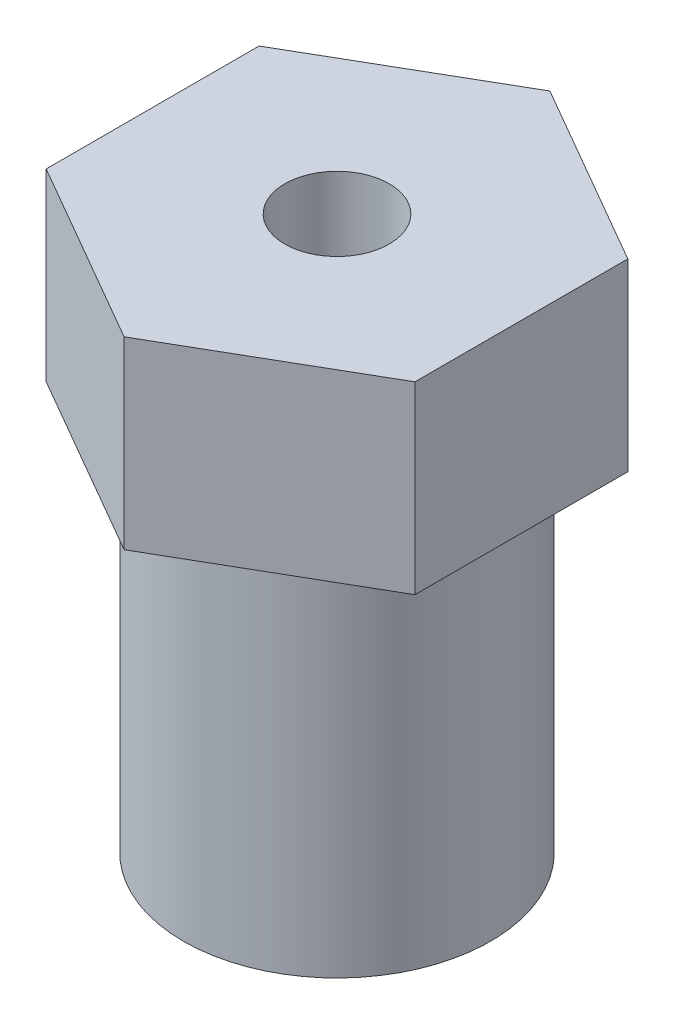
ISO-10303-21;
HEADER;
FILE_DESCRIPTION(('STEP AP214'),'2;1');
FILE_NAME('part.step','',(''),(''),'','','');
FILE_SCHEMA(('AUTOMOTIVE_DESIGN { 1 0 10303 214 1 1 1 1 }'));
ENDSEC;
DATA;
#1=APPLICATION_CONTEXT('core data for automotive mechanical design processes');
#2=APPLICATION_PROTOCOL_DEFINITION('international standard','automotive_design',2000,#1);
#3=PRODUCT_CONTEXT('',#1,'mechanical');
#4=PRODUCT('Part','Part','',(#3));
#5=PRODUCT_RELATED_PRODUCT_CATEGORY('part','',(#4));
#6=PRODUCT_DEFINITION_FORMATION('','',#4);
#7=PRODUCT_DEFINITION_CONTEXT('part definition',#1,'design');
#8=PRODUCT_DEFINITION('design','',#6,#7);
#9=PRODUCT_DEFINITION_SHAPE('','',#8);
#10=(LENGTH_UNIT() NAMED_UNIT(*) SI_UNIT(.MILLI.,.METRE.));
#11=(NAMED_UNIT(*) PLANE_ANGLE_UNIT() SI_UNIT($,.RADIAN.));
#12=(NAMED_UNIT(*) SI_UNIT($,.STERADIAN.) SOLID_ANGLE_UNIT());
#13=UNCERTAINTY_MEASURE_WITH_UNIT(LENGTH_MEASURE(1.E-05),#10,'distance_accuracy_value','');
#14=(GEOMETRIC_REPRESENTATION_CONTEXT(3) GLOBAL_UNCERTAINTY_ASSIGNED_CONTEXT((#13)) GLOBAL_UNIT_ASSIGNED_CONTEXT((#10,
#11,#12)) REPRESENTATION_CONTEXT('',''));
#15=CARTESIAN_POINT('',(0.,0.,0.));
#16=DIRECTION('',(0.,0.,1.));
#17=DIRECTION('',(1.,0.,0.));
#18=AXIS2_PLACEMENT_3D('',#15,#16,#17);
#19=CARTESIAN_POINT('',(-3.,6.,-5.19615242270664));
#20=DIRECTION('',(-0.5,0.,-0.866025403784438));
#21=DIRECTION('',(-0.866025403784439,0.,0.5));
#22=AXIS2_PLACEMENT_3D('',#19,#20,#21);
#23=CYLINDRICAL_SURFACE('',#22,1.69999999999999);
#24=CARTESIAN_POINT('',(0.,6.79999999999998,-3.));
#25=CARTESIAN_POINT('',(-0.05408169265973,6.88781961083474,-2.99999842011512));
#26=CARTESIAN_POINT('',(-0.11584986274738,6.97092265030721,-2.99853255813965));
#27=CARTESIAN_POINT('',(-0.251580183169669,7.12625088742073,-2.99020647210895));
#28=CARTESIAN_POINT('',(-0.325555140778262,7.19846450602118,-2.98334055355004));
#29=CARTESIAN_POINT('',(-0.482982376331943,7.33058608028531,-2.96193211334839));
#30=CARTESIAN_POINT('',(-0.56644430771567,7.39048132419887,-2.94738171651048));
#31=CARTESIAN_POINT('',(-0.739897877773428,7.49601278090847,-2.90868096501998));
#32=CARTESIAN_POINT('',(-0.829883890136409,7.5416611040453,-2.88453880357756));
#33=CARTESIAN_POINT('',(-1.00887962701823,7.6149604397967,-2.82676304946186));
#34=CARTESIAN_POINT('',(-1.09774410608916,7.64334225341772,-2.79361673714729));
#35=CARTESIAN_POINT('',(-1.27489957816332,7.68367031629994,-2.71733254736103));
#36=CARTESIAN_POINT('',(-1.36319104222212,7.6956324155236,-2.67420435248285));
#37=CARTESIAN_POINT('',(-1.5248859990315,7.7019614399458,-2.58499256321337));
#38=CARTESIAN_POINT('',(-1.59878255194164,7.69831671712663,-2.53992971618292));
#39=CARTESIAN_POINT('',(-1.74116848270436,7.67804128946428,-2.44451880767874));
#40=CARTESIAN_POINT('',(-1.80965816352961,7.66141131281595,-2.39417104271284));
#41=CARTESIAN_POINT('',(-1.93804307206996,7.61653585479174,-2.29141739960441));
#42=CARTESIAN_POINT('',(-1.99810829551771,7.58858622480206,-2.23909263634188));
#43=CARTESIAN_POINT('',(-2.11081351753923,7.52217046659896,-2.13317926024697));
#44=CARTESIAN_POINT('',(-2.16345193033774,7.48370209755677,-2.0795903803424));
#45=CARTESIAN_POINT('',(-2.26567953207534,7.39325492628011,-1.9679818983662));
#46=CARTESIAN_POINT('',(-2.31450655739578,7.340341035683,-1.91002388404943));
#47=CARTESIAN_POINT('',(-2.40314245716176,7.22447784736072,-1.79723761210463));
#48=CARTESIAN_POINT('',(-2.44294174111377,7.16151799724178,-1.74241272872222));
#49=CARTESIAN_POINT('',(-2.51798674739819,7.01879947622295,-1.63238218969293));
#50=CARTESIAN_POINT('',(-2.55216808185899,6.93793922894885,-1.57787065692512));
#51=CARTESIAN_POINT('',(-2.61024937587533,6.76646107669214,-1.47981572008613));
#52=CARTESIAN_POINT('',(-2.63415947316876,6.67585290393186,-1.43626151877994));
#53=CARTESIAN_POINT('',(-2.6684041815498,6.50521626410009,-1.37138485768083));
#54=CARTESIAN_POINT('',(-2.68047452737696,6.42655677976909,-1.34738620379777));
#55=CARTESIAN_POINT('',(-2.6982723487657,6.26587538127644,-1.31138832935055));
#56=CARTESIAN_POINT('',(-2.70400741191225,6.1838576116568,-1.29937475627676));
#57=CARTESIAN_POINT('',(-2.7091706920176,6.0184960092893,-1.28857865215158));
#58=CARTESIAN_POINT('',(-2.70858019415916,5.93514897049141,-1.28983538248938));
#59=CARTESIAN_POINT('',(-2.70104647521384,5.76998520070034,-1.30553343364534));
#60=CARTESIAN_POINT('',(-2.69410005791733,5.68816926077823,-1.31998138794386));
#61=CARTESIAN_POINT('',(-2.67421401115099,5.53134855143156,-1.35979577621028));
#62=CARTESIAN_POINT('',(-2.66150650325925,5.45620367579721,-1.3847368571845));
#63=CARTESIAN_POINT('',(-2.63010523926771,5.31081793839377,-1.44348611278553));
#64=CARTESIAN_POINT('',(-2.61140932149964,5.24057885866526,-1.47729748857125));
#65=CARTESIAN_POINT('',(-2.56480646862616,5.09648655712385,-1.55697753274693));
#66=CARTESIAN_POINT('',(-2.53597770764162,5.0234989025504,-1.60387068535018));
#67=CARTESIAN_POINT('',(-2.46992452567164,4.88600319753576,-1.70383892133012));
#68=CARTESIAN_POINT('',(-2.43269314476303,4.8215022471779,-1.75691911172994));
#69=CARTESIAN_POINT('',(-2.34377377735252,4.69388203930191,-1.87425823230111));
#70=CARTESIAN_POINT('',(-2.29081045598446,4.63213443732866,-1.93905728510565));
#71=CARTESIAN_POINT('',(-2.17321979261564,4.5226880254782,-2.069986734252));
#72=CARTESIAN_POINT('',(-2.10859568958922,4.4749853240572,-2.1361167563747));
#73=CARTESIAN_POINT('',(-1.97098953851385,4.39729840260364,-2.26354234621131));
#74=CARTESIAN_POINT('',(-1.8984553124316,4.36667144558871,-2.32492510802883));
#75=CARTESIAN_POINT('',(-1.74461579704232,4.32196888379412,-2.44246757305399));
#76=CARTESIAN_POINT('',(-1.66332054009747,4.30787456262987,-2.49863311612159));
#77=CARTESIAN_POINT('',(-1.50529060531348,4.29778908231391,-2.59646757662748));
#78=CARTESIAN_POINT('',(-1.42925746120449,4.29975398732385,-2.63907102471868));
#79=CARTESIAN_POINT('',(-1.27497936146063,4.31689698120534,-2.71696325524233));
#80=CARTESIAN_POINT('',(-1.1967345756648,4.33207405812473,-2.75225259762353));
#81=CARTESIAN_POINT('',(-1.04315970159673,4.37416835500948,-2.81397417775792));
#82=CARTESIAN_POINT('',(-0.967818867473064,4.40068032070097,-2.84066093632769));
#83=CARTESIAN_POINT('',(-0.819503870906033,4.46430590331753,-2.88694566956916));
#84=CARTESIAN_POINT('',(-0.746530173326471,4.5014215887577,-2.90654225943778));
#85=CARTESIAN_POINT('',(-0.598380708122485,4.58890626107131,-2.94078680808685));
#86=CARTESIAN_POINT('',(-0.523592864252902,4.64016439928516,-2.95483452376178));
#87=CARTESIAN_POINT('',(-0.380897858422043,4.75270872757631,-2.97659840220921));
#88=CARTESIAN_POINT('',(-0.31299769745678,4.81400495871614,-2.98430817819977));
#89=CARTESIAN_POINT('',(-0.178475553782575,4.95339298110832,-2.99553382772199));
#90=CARTESIAN_POINT('',(-0.11296805612401,5.03261553520194,-2.99844115570703));
#91=CARTESIAN_POINT('',(0.00395170643339162,5.2009106307356,-3.00056838201603));
#92=CARTESIAN_POINT('',(0.0553752348809439,5.28997522059763,-2.99979123613255));
#93=CARTESIAN_POINT('',(0.132870092929511,5.45905164296436,-2.99725987916219));
#94=CARTESIAN_POINT('',(0.161862463285092,5.53772397881135,-2.99571121709793));
#95=CARTESIAN_POINT('',(0.206280719317359,5.69878963935455,-2.99298401410815));
#96=CARTESIAN_POINT('',(0.221722993947297,5.78117834184618,-2.99180502717033));
#97=CARTESIAN_POINT('',(0.237833260595179,5.94772326187039,-2.99056976027155));
#98=CARTESIAN_POINT('',(0.238447907908849,6.03188477131879,-2.99051753407944));
#99=CARTESIAN_POINT('',(0.224707994913821,6.19897352067671,-2.99157964052133));
#100=CARTESIAN_POINT('',(0.210348528585427,6.28190034703134,-2.99269435548469));
#101=CARTESIAN_POINT('',(0.168941074284039,6.4400278492101,-2.99530546548334));
#102=CARTESIAN_POINT('',(0.142561406538309,6.51540759423706,-2.9967800597025));
#103=CARTESIAN_POINT('',(0.0789893740049566,6.66146584789714,-2.99912814947559));
#104=CARTESIAN_POINT('',(0.0417894041836181,6.73214100683732,-3.00000122079108));
#105=CARTESIAN_POINT('',(0.,6.79999999999998,-3.));
#106=B_SPLINE_CURVE_WITH_KNOTS('',3,(#24,#25,#26,#27,#28,#29,#30,#31,#32,#33,#34,#35,#36,#37,
#38,#39,#40,#41,#42,#43,#44,#45,#46,#47,#48,#49,#50,#51,#52,#53,#54,#55,#56,#57,#58,#59,#60,#61,
#62,#63,#64,#65,#66,#67,#68,#69,#70,#71,#72,#73,#74,#75,#76,#77,#78,#79,#80,#81,#82,#83,#84,#85,
#86,#87,#88,#89,#90,#91,#92,#93,#94,#95,#96,#97,#98,#99,#100,#101,#102,#103,#104,#105),
.UNSPECIFIED.,.T.,.F.,(4,2,2,2,2,2,2,2,2,2,2,2,2,2,2,2,2,2,2,2,2,2,2,2,2,2,2,2,2,2,2,2,2,2,2,2,
2,2,2,2,4),(0.,0.309103118637499,0.618532632506998,0.928279872558717,1.23776309584082,
1.53302093289259,1.82799355642621,2.08658144245674,2.3451548282823,2.59736634859509,
2.84963163996676,3.12581233294823,3.40228506265132,3.71084137226387,4.01909243233194,
4.26740108876914,4.51541202958213,4.76415693822371,5.01302700233424,5.25265587010564,
5.49237133565607,5.76557012074642,6.03899603344368,6.34947380416687,6.65986546695699,
6.9576104158414,7.25501796517906,7.51522377722609,7.77540966123482,8.02698283348582,
8.27860511479093,8.55275851048861,8.82718783481127,9.13428758585227,9.44114101420879,
9.69166512924072,9.94188581393857,10.1930065728861,10.4442096332381,10.6828881960336,
10.9217349207548),.UNSPECIFIED.);
#107=CARTESIAN_POINT('',(0.,6.79999999999998,-3.));
#108=VERTEX_POINT('',#107);
#109=EDGE_CURVE('E147',#108,#108,#106,.T.);
#110=ORIENTED_EDGE('',*,*,#109,.T.);
#111=EDGE_LOOP('',(#110));
#112=FACE_BOUND('',#111,.T.);
#113=CARTESIAN_POINT('',(-2.5,6.,-4.3301270189222));
#114=DIRECTION('',(-0.5,0.,-0.866025403784438));
#115=DIRECTION('',(-0.866025403784438,0.,0.5));
#116=AXIS2_PLACEMENT_3D('',#113,#114,#115);
#117=CIRCLE('',#116,1.69999999999999);
#118=CARTESIAN_POINT('',(-3.97224318643354,6.,-3.4801270189222));
#119=VERTEX_POINT('',#118);
#120=EDGE_CURVE('E135',#119,#119,#117,.F.);
#121=ORIENTED_EDGE('',*,*,#120,.F.);
#122=EDGE_LOOP('',(#121));
#123=FACE_BOUND('',#122,.T.);
#124=ADVANCED_FACE('F35',(#112,#123),#23,.F.);
#125=CARTESIAN_POINT('',(4.5006830127019,6.,7.79541164676185));
#126=DIRECTION('',(-0.5,0.,-0.866025403784438));
#127=DIRECTION('',(-0.866025403784439,0.,0.5));
#128=AXIS2_PLACEMENT_3D('',#125,#126,#127);
#129=CYLINDRICAL_SURFACE('',#128,2.5493621783471);
#130=CARTESIAN_POINT('',(-4.35843746343336,6.,-2.45031077158401));
#131=CARTESIAN_POINT('',(-4.35843474018136,6.13242592835763,-2.45032826808866));
#132=CARTESIAN_POINT('',(-4.35254571689391,6.26501521387592,-2.46088318635183));
#133=CARTESIAN_POINT('',(-4.3290047454725,6.5260879254046,-2.50204754187415));
#134=CARTESIAN_POINT('',(-4.31132906271113,6.65456251753066,-2.53269744201476));
#135=CARTESIAN_POINT('',(-4.26437981041503,6.90313592021332,-2.61096055717455));
#136=CARTESIAN_POINT('',(-4.23516979816396,7.02327645848354,-2.65848067025964));
#137=CARTESIAN_POINT('',(-4.1650929988781,7.25358987936444,-2.76697644766752));
#138=CARTESIAN_POINT('',(-4.12422519082727,7.36376188779507,-2.8279532904551));
#139=CARTESIAN_POINT('',(-4.02657949662629,7.58146147598714,-2.96552832104463));
#140=CARTESIAN_POINT('',(-3.96873595591368,7.68794766276453,-3.04301875519778));
#141=CARTESIAN_POINT('',(-3.83866690142188,7.8853238227186,-3.20553792859178));
#142=CARTESIAN_POINT('',(-3.76643400570172,7.97620574594729,-3.29057052459471));
#143=CARTESIAN_POINT('',(-3.60177665440593,8.14609788539377,-3.47031239521371));
#144=CARTESIAN_POINT('',(-3.508284851063,8.22381236694947,-3.56528057340904));
#145=CARTESIAN_POINT('',(-3.30526791451359,8.35605154263622,-3.75424801663677));
#146=CARTESIAN_POINT('',(-3.19575335964838,8.41059144475398,-3.84824787746577));
#147=CARTESIAN_POINT('',(-2.97137567063272,8.49075963192941,-4.02364117242568));
#148=CARTESIAN_POINT('',(-2.85749734597724,8.51821834491896,-4.10545336455949));
#149=CARTESIAN_POINT('',(-2.62093520639103,8.54948765515492,-4.26035662772273));
#150=CARTESIAN_POINT('',(-2.498257015185,8.55331322178932,-4.33345319050352));
#151=CARTESIAN_POINT('',(-2.25966278054755,8.53787982490927,-4.46213407461893));
#152=CARTESIAN_POINT('',(-2.14413709987689,8.52067515398633,-4.51870389883828));
#153=CARTESIAN_POINT('',(-1.91282113769791,8.46736669165771,-4.62137760300195));
#154=CARTESIAN_POINT('',(-1.79703083696716,8.43126148083563,-4.66748069652977));
#155=CARTESIAN_POINT('',(-1.56706760050104,8.34098207385927,-4.74967624045102));
#156=CARTESIAN_POINT('',(-1.45293699688411,8.28657271447384,-4.78562658432226));
#157=CARTESIAN_POINT('',(-1.23100702865721,8.1615751811913,-4.84746453339607));
#158=CARTESIAN_POINT('',(-1.12320991413972,8.09098130057776,-4.87334858048785));
#159=CARTESIAN_POINT('',(-0.906659690568706,7.92774404988494,-4.91847117400741));
#160=CARTESIAN_POINT('',(-0.798833314420978,7.83362392760335,-4.93681852560103));
#161=CARTESIAN_POINT('',(-0.597501973262954,7.62993839045092,-4.96521398389935));
#162=CARTESIAN_POINT('',(-0.50400880089441,7.52036039842528,-4.9752552863403));
#163=CARTESIAN_POINT('',(-0.329217340193053,7.27978167968964,-4.98997266328497));
#164=CARTESIAN_POINT('',(-0.249179896839478,7.14783108411252,-4.99423766575049));
#165=CARTESIAN_POINT('',(-0.114433323471274,6.87152113433902,-4.99914941394098));
#166=CARTESIAN_POINT('',(-0.0596969641099141,6.72717531942434,-4.9998000578353));
#167=CARTESIAN_POINT('',(0.0168055637891447,6.44229734119767,-5.00010827943268));
#168=CARTESIAN_POINT('',(0.0408618940561221,6.30238617850803,-4.99984124330395));
#169=CARTESIAN_POINT('',(0.061614730456127,6.02058812721735,-4.99963366800008));
#170=CARTESIAN_POINT('',(0.0583324240379804,5.87870285368028,-4.99969287597365));
#171=CARTESIAN_POINT('',(0.0267530582802505,5.61455469511559,-4.99994591571752));
#172=CARTESIAN_POINT('',(0.00140079561449291,5.49192426374894,-5.00012334064891));
#173=CARTESIAN_POINT('',(-0.068626119677459,5.25232668651963,-4.99965069481582));
#174=CARTESIAN_POINT('',(-0.113307363467762,5.13536148763809,-4.99900034163272));
#175=CARTESIAN_POINT('',(-0.222002207433863,4.90427155618175,-4.99537667042951));
#176=CARTESIAN_POINT('',(-0.286810425681824,4.7905248719053,-4.99229789073031));
#177=CARTESIAN_POINT('',(-0.431988936743663,4.57365709897623,-4.9818350277141));
#178=CARTESIAN_POINT('',(-0.51236724412999,4.47054152466295,-4.97444872318109));
#179=CARTESIAN_POINT('',(-0.69745418830475,4.26360365632202,-4.95210464042128));
#180=CARTESIAN_POINT('',(-0.803974279151221,4.16148785951105,-4.9362754701477));
#181=CARTESIAN_POINT('',(-1.02977465854472,3.97494960903647,-4.89415508221757));
#182=CARTESIAN_POINT('',(-1.14905979000597,3.89053390679263,-4.86785988350439));
#183=CARTESIAN_POINT('',(-1.40031760692858,3.73956011764782,-4.80171552553947));
#184=CARTESIAN_POINT('',(-1.53256632220991,3.67362531954706,-4.7614773776739));
#185=CARTESIAN_POINT('',(-1.80156631559727,3.56601410379657,-4.66633041008536));
#186=CARTESIAN_POINT('',(-1.93831336708179,3.52431556500349,-4.61143503545447));
#187=CARTESIAN_POINT('',(-2.19794552418598,3.47008458744953,-4.49304497853895));
#188=CARTESIAN_POINT('',(-2.32092533345073,3.45517894339486,-4.43084372234883));
#189=CARTESIAN_POINT('',(-2.56175475106549,3.44788273191579,-4.29609361061714));
#190=CARTESIAN_POINT('',(-2.6796062895383,3.45548361804209,-4.2235486928529));
#191=CARTESIAN_POINT('',(-2.89845805694549,3.49145075216617,-4.07616724358668));
#192=CARTESIAN_POINT('',(-3.00006048010486,3.51832113375102,-4.00184947660826));
#193=CARTESIAN_POINT('',(-3.19347436338754,3.58999420262173,-3.84927312756091));
#194=CARTESIAN_POINT('',(-3.28528446897587,3.63479936669591,-3.77101400249702));
#195=CARTESIAN_POINT('',(-3.46142306098998,3.74297774102967,-3.61017573080965));
#196=CARTESIAN_POINT('',(-3.54528232980237,3.80704495954281,-3.52755217311567));
#197=CARTESIAN_POINT('',(-3.70046397569924,3.95106352218964,-3.36441129880491));
#198=CARTESIAN_POINT('',(-3.77178062380621,4.03102208953492,-3.28389495890085));
#199=CARTESIAN_POINT('',(-3.90857223852594,4.2140842630159,-3.1201887506843));
#200=CARTESIAN_POINT('',(-3.97269093029188,4.31872287125662,-3.03757634063891));
#201=CARTESIAN_POINT('',(-4.08604752618703,4.54319552239309,-2.88329644292488));
#202=CARTESIAN_POINT('',(-4.13527135592535,4.66304378632809,-2.81163933852671));
#203=CARTESIAN_POINT('',(-4.22072311908496,4.92062689847625,-2.68175372708998));
#204=CARTESIAN_POINT('',(-4.25638926030063,5.05886672872528,-2.6241354492129));
#205=CARTESIAN_POINT('',(-4.29810199527818,5.27364798589101,-2.55480591124155));
#206=CARTESIAN_POINT('',(-4.31003639808117,5.34641017844248,-2.5345562184029));
#207=CARTESIAN_POINT('',(-4.33001368128678,5.49389018875048,-2.50027591637198));
#208=CARTESIAN_POINT('',(-4.33805924318102,5.5686066214101,-2.48624102242057));
#209=CARTESIAN_POINT('',(-4.3489138405607,5.70277321144238,-2.46719276618697));
#210=CARTESIAN_POINT('',(-4.35248405865753,5.76198058953385,-2.46087638550313));
#211=CARTESIAN_POINT('',(-4.35724656224872,5.88078092214493,-2.4524313099679));
#212=CARTESIAN_POINT('',(-4.35843868960479,5.94037390204194,-2.4503028936079));
#213=CARTESIAN_POINT('',(-4.35843746343336,6.,-2.45031077158401));
#214=B_SPLINE_CURVE_WITH_KNOTS('',3,(#130,#131,#132,#133,#134,#135,#136,#137,#138,#139,#140,
#141,#142,#143,#144,#145,#146,#147,#148,#149,#150,#151,#152,#153,#154,#155,#156,#157,#158,#159,
#160,#161,#162,#163,#164,#165,#166,#167,#168,#169,#170,#171,#172,#173,#174,#175,#176,#177,#178,
#179,#180,#181,#182,#183,#184,#185,#186,#187,#188,#189,#190,#191,#192,#193,#194,#195,#196,#197,
#198,#199,#200,#201,#202,#203,#204,#205,#206,#207,#208,#209,#210,#211,#212,#213),.UNSPECIFIED.,
.T.,.F.,(4,2,2,2,2,2,2,2,2,2,2,2,2,2,2,2,2,2,2,2,2,2,2,2,2,2,2,2,2,2,2,2,2,2,2,2,2,2,2,2,2,4),
(0.,0.397036179111605,0.794874288400811,1.19055012586621,1.58626062815893,2.01598646991388,
2.44593333743397,2.90631452459125,3.36639312482059,3.79265457690301,4.21864600451408,
4.60615226712096,4.99368763533404,5.38640514339148,5.77926133851125,6.21032683141178,
6.64174510174315,7.10248735089337,7.56273258224711,7.9861038316588,8.40914699881666,
8.78313490643325,9.15725044422007,9.54857222927018,9.94009598175743,10.3833465995609,
10.8267659819339,11.2837116564872,11.7402396057355,12.1538530676552,12.5673094874606,
12.9517283789422,13.3362003768881,13.7366435004784,14.1372690584275,14.5791196874475,
15.0213865336425,15.4803767371496,15.7094618606165,15.9383887957455,16.117146417492,
16.2959159258671),.UNSPECIFIED.);
#215=CARTESIAN_POINT('',(-2.50000000000001,8.5493621783471,-4.3301270189222));
#216=VERTEX_POINT('',#215);
#217=CARTESIAN_POINT('',(-2.5,3.4506378216529,-4.33012701892219));
#218=VERTEX_POINT('',#217);
#219=EDGE_CURVE('E139',#216,#218,#214,.T.);
#220=ORIENTED_EDGE('',*,*,#219,.T.);
#221=CARTESIAN_POINT('',(-2.5,6.,-4.3301270189222));
#222=DIRECTION('',(-0.5,0.,-0.866025403784438));
#223=DIRECTION('',(-0.866025403784438,0.,0.5));
#224=AXIS2_PLACEMENT_3D('',#221,#222,#223);
#225=CIRCLE('',#224,2.5493621783471);
#226=EDGE_CURVE('E49',#216,#218,#225,.T.);
#227=ORIENTED_EDGE('',*,*,#226,.F.);
#228=EDGE_LOOP('',(#220,#227));
#229=FACE_BOUND('',#228,.T.);
#230=ADVANCED_FACE('F154',(#229),#129,.T.);
#231=EDGE_CURVE('E138',#218,#216,#214,.T.);
#232=ORIENTED_EDGE('',*,*,#231,.T.);
#233=EDGE_CURVE('E133',#218,#216,#225,.T.);
#234=ORIENTED_EDGE('',*,*,#233,.F.);
#235=EDGE_LOOP('',(#232,#234));
#236=FACE_BOUND('',#235,.T.);
#237=ADVANCED_FACE('F181',(#236),#129,.T.);
#238=CARTESIAN_POINT('',(0.,0.,0.));
#239=DIRECTION('',(0.,1.,0.));
#240=DIRECTION('',(0.,0.,1.));
#241=AXIS2_PLACEMENT_3D('',#238,#239,#240);
#242=PLANE('',#241);
#243=CARTESIAN_POINT('',(0.,0.,0.));
#244=DIRECTION('',(0.,1.,0.));
#245=DIRECTION('',(0.,0.,1.));
#246=AXIS2_PLACEMENT_3D('',#243,#244,#245);
#247=CIRCLE('',#246,5.);
#248=CARTESIAN_POINT('',(0.,0.,5.));
#249=VERTEX_POINT('',#248);
#250=EDGE_CURVE('E43',#249,#249,#247,.T.);
#251=ORIENTED_EDGE('',*,*,#250,.F.);
#252=EDGE_LOOP('',(#251));
#253=FACE_BOUND('',#252,.T.);
#254=CARTESIAN_POINT('',(0.,0.,0.));
#255=DIRECTION('',(0.,1.,0.));
#256=DIRECTION('',(0.,0.,1.));
#257=AXIS2_PLACEMENT_3D('',#254,#255,#256);
#258=CIRCLE('',#257,3.);
#259=CARTESIAN_POINT('',(0.,0.,3.));
#260=VERTEX_POINT('',#259);
#261=EDGE_CURVE('E104',#260,#260,#258,.T.);
#262=ORIENTED_EDGE('',*,*,#261,.T.);
#263=EDGE_LOOP('',(#262));
#264=FACE_BOUND('',#263,.T.);
#265=ADVANCED_FACE('F216',(#253,#264),#242,.F.);
#266=CARTESIAN_POINT('',(0.,14.,0.));
#267=DIRECTION('',(0.,-1.,0.));
#268=DIRECTION('',(0.,0.,-1.));
#269=AXIS2_PLACEMENT_3D('',#266,#267,#268);
#270=CYLINDRICAL_SURFACE('',#269,5.);
#271=CARTESIAN_POINT('',(0.,12.,0.));
#272=DIRECTION('',(0.,-1.,0.));
#273=DIRECTION('',(0.,0.,-1.));
#274=AXIS2_PLACEMENT_3D('',#271,#272,#273);
#275=CIRCLE('',#274,5.);
#276=CARTESIAN_POINT('',(0.,12.,-5.));
#277=VERTEX_POINT('',#276);
#278=EDGE_CURVE('E130',#277,#277,#275,.T.);
#279=ORIENTED_EDGE('',*,*,#278,.T.);
#280=EDGE_LOOP('',(#279));
#281=FACE_BOUND('',#280,.T.);
#282=ORIENTED_EDGE('',*,*,#219,.F.);
#283=ORIENTED_EDGE('',*,*,#231,.F.);
#284=EDGE_LOOP('',(#282,#283));
#285=FACE_BOUND('',#284,.T.);
#286=ORIENTED_EDGE('',*,*,#250,.T.);
#287=EDGE_LOOP('',(#286));
#288=FACE_BOUND('',#287,.T.);
#289=ADVANCED_FACE('F37',(#281,#285,#288),#270,.T.);
#290=CARTESIAN_POINT('',(0.,14.,0.));
#291=DIRECTION('',(0.,-1.,0.));
#292=DIRECTION('',(0.,0.,-1.));
#293=AXIS2_PLACEMENT_3D('',#290,#291,#292);
#294=CYLINDRICAL_SURFACE('',#293,3.);
#295=CARTESIAN_POINT('',(0.,12.,0.));
#296=DIRECTION('',(0.,-1.,0.));
#297=DIRECTION('',(0.,0.,-1.));
#298=AXIS2_PLACEMENT_3D('',#295,#296,#297);
#299=CIRCLE('',#298,3.);
#300=CARTESIAN_POINT('',(0.,12.,-3.));
#301=VERTEX_POINT('',#300);
#302=EDGE_CURVE('E11',#301,#301,#299,.T.);
#303=ORIENTED_EDGE('',*,*,#302,.F.);
#304=EDGE_LOOP('',(#303));
#305=FACE_BOUND('',#304,.T.);
#306=ORIENTED_EDGE('',*,*,#109,.F.);
#307=EDGE_LOOP('',(#306));
#308=FACE_BOUND('',#307,.T.);
#309=ORIENTED_EDGE('',*,*,#261,.F.);
#310=EDGE_LOOP('',(#309));
#311=FACE_BOUND('',#310,.T.);
#312=ADVANCED_FACE('F161',(#305,#308,#311),#294,.F.);
#313=CARTESIAN_POINT('',(-2.5,6.,-4.3301270189222));
#314=DIRECTION('',(-0.5,0.,-0.866025403784438));
#315=DIRECTION('',(-0.866025403784438,0.,0.5));
#316=AXIS2_PLACEMENT_3D('',#313,#314,#315);
#317=PLANE('',#316);
#318=ORIENTED_EDGE('',*,*,#226,.T.);
#319=ORIENTED_EDGE('',*,*,#233,.T.);
#320=EDGE_LOOP('',(#318,#319));
#321=FACE_BOUND('',#320,.T.);
#322=ORIENTED_EDGE('',*,*,#120,.T.);
#323=EDGE_LOOP('',(#322));
#324=FACE_BOUND('',#323,.T.);
#325=ADVANCED_FACE('F158',(#321,#324),#317,.T.);
#326=CARTESIAN_POINT('',(0.,12.,0.));
#327=DIRECTION('',(0.,-1.,0.));
#328=DIRECTION('',(0.,0.,-1.));
#329=AXIS2_PLACEMENT_3D('',#326,#327,#328);
#330=PLANE('',#329);
#331=ORIENTED_EDGE('',*,*,#278,.F.);
#332=EDGE_LOOP('',(#331));
#333=FACE_BOUND('',#332,.T.);
#334=DIRECTION('',(0.866025403784438,0.,-0.5));
#335=VECTOR('',#334,1.);
#336=CARTESIAN_POINT('',(-6.,12.,-3.46410161513775));
#337=LINE('',#336,#335);
#338=CARTESIAN_POINT('',(-6.,12.,-3.46410161513775));
#339=VERTEX_POINT('',#338);
#340=CARTESIAN_POINT('',(0.,12.,-6.92820323027551));
#341=VERTEX_POINT('',#340);
#342=EDGE_CURVE('E100',#339,#341,#337,.T.);
#343=ORIENTED_EDGE('',*,*,#342,.T.);
#344=DIRECTION('',(0.866025403784439,0.,0.5));
#345=VECTOR('',#344,1.);
#346=CARTESIAN_POINT('',(0.,12.,-6.92820323027551));
#347=LINE('',#346,#345);
#348=CARTESIAN_POINT('',(6.,12.,-3.46410161513776));
#349=VERTEX_POINT('',#348);
#350=EDGE_CURVE('E108',#341,#349,#347,.T.);
#351=ORIENTED_EDGE('',*,*,#350,.T.);
#352=DIRECTION('',(0.,0.,1.));
#353=VECTOR('',#352,1.);
#354=CARTESIAN_POINT('',(6.,12.,-3.46410161513776));
#355=LINE('',#354,#353);
#356=CARTESIAN_POINT('',(6.,12.,3.46410161513775));
#357=VERTEX_POINT('',#356);
#358=EDGE_CURVE('E114',#349,#357,#355,.T.);
#359=ORIENTED_EDGE('',*,*,#358,.T.);
#360=DIRECTION('',(-0.866025403784439,0.,0.5));
#361=VECTOR('',#360,1.);
#362=CARTESIAN_POINT('',(6.,12.,3.46410161513775));
#363=LINE('',#362,#361);
#364=CARTESIAN_POINT('',(0.,12.,6.92820323027551));
#365=VERTEX_POINT('',#364);
#366=EDGE_CURVE('E124',#357,#365,#363,.T.);
#367=ORIENTED_EDGE('',*,*,#366,.T.);
#368=DIRECTION('',(-0.866025403784439,0.,-0.5));
#369=VECTOR('',#368,1.);
#370=CARTESIAN_POINT('',(0.,12.,6.92820323027551));
#371=LINE('',#370,#369);
#372=CARTESIAN_POINT('',(-6.,12.,3.46410161513776));
#373=VERTEX_POINT('',#372);
#374=EDGE_CURVE('E127',#365,#373,#371,.T.);
#375=ORIENTED_EDGE('',*,*,#374,.T.);
#376=DIRECTION('',(0.,0.,-1.));
#377=VECTOR('',#376,1.);
#378=CARTESIAN_POINT('',(-6.,12.,3.46410161513776));
#379=LINE('',#378,#377);
#380=EDGE_CURVE('E120',#373,#339,#379,.T.);
#381=ORIENTED_EDGE('',*,*,#380,.T.);
#382=EDGE_LOOP('',(#343,#351,#359,#367,#375,#381));
#383=FACE_BOUND('',#382,.T.);
#384=ADVANCED_FACE('F117',(#333,#383),#330,.T.);
#385=ORIENTED_EDGE('',*,*,#302,.T.);
#386=EDGE_LOOP('',(#385));
#387=FACE_BOUND('',#386,.T.);
#388=ADVANCED_FACE('F168',(#387),#330,.T.);
#389=CARTESIAN_POINT('',(-6.,18.,-3.46410161513775));
#390=DIRECTION('',(1.,0.,0.));
#391=DIRECTION('',(0.,0.,-1.));
#392=AXIS2_PLACEMENT_3D('',#389,#390,#391);
#393=PLANE('',#392);
#394=DIRECTION('',(0.,-1.,0.));
#395=VECTOR('',#394,1.);
#396=CARTESIAN_POINT('',(-6.,18.,-3.46410161513775));
#397=LINE('',#396,#395);
#398=CARTESIAN_POINT('',(-6.,18.,-3.46410161513775));
#399=VERTEX_POINT('',#398);
#400=EDGE_CURVE('E105',#399,#339,#397,.T.);
#401=ORIENTED_EDGE('',*,*,#400,.T.);
#402=ORIENTED_EDGE('',*,*,#380,.F.);
#403=DIRECTION('',(0.,-1.,0.));
#404=VECTOR('',#403,1.);
#405=CARTESIAN_POINT('',(-6.,18.,3.46410161513776));
#406=LINE('',#405,#404);
#407=CARTESIAN_POINT('',(-6.,18.,3.46410161513776));
#408=VERTEX_POINT('',#407);
#409=EDGE_CURVE('E235',#408,#373,#406,.T.);
#410=ORIENTED_EDGE('',*,*,#409,.F.);
#411=DIRECTION('',(0.,0.,1.));
#412=VECTOR('',#411,1.);
#413=CARTESIAN_POINT('',(-6.,18.,-3.46410161513775));
#414=LINE('',#413,#412);
#415=EDGE_CURVE('E247',#399,#408,#414,.T.);
#416=ORIENTED_EDGE('',*,*,#415,.F.);
#417=EDGE_LOOP('',(#401,#402,#410,#416));
#418=FACE_BOUND('',#417,.T.);
#419=ADVANCED_FACE('F173',(#418),#393,.F.);
#420=CARTESIAN_POINT('',(-6.,18.,3.46410161513776));
#421=DIRECTION('',(0.5,0.,-0.866025403784439));
#422=DIRECTION('',(-0.866025403784439,0.,-0.5));
#423=AXIS2_PLACEMENT_3D('',#420,#421,#422);
#424=PLANE('',#423);
#425=ORIENTED_EDGE('',*,*,#409,.T.);
#426=ORIENTED_EDGE('',*,*,#374,.F.);
#427=DIRECTION('',(0.,-1.,0.));
#428=VECTOR('',#427,1.);
#429=CARTESIAN_POINT('',(0.,18.,6.92820323027551));
#430=LINE('',#429,#428);
#431=CARTESIAN_POINT('',(0.,18.,6.92820323027551));
#432=VERTEX_POINT('',#431);
#433=EDGE_CURVE('E237',#432,#365,#430,.T.);
#434=ORIENTED_EDGE('',*,*,#433,.F.);
#435=DIRECTION('',(0.866025403784439,0.,0.5));
#436=VECTOR('',#435,1.);
#437=CARTESIAN_POINT('',(-6.,18.,3.46410161513776));
#438=LINE('',#437,#436);
#439=EDGE_CURVE('E245',#408,#432,#438,.T.);
#440=ORIENTED_EDGE('',*,*,#439,.F.);
#441=EDGE_LOOP('',(#425,#426,#434,#440));
#442=FACE_BOUND('',#441,.T.);
#443=ADVANCED_FACE('F202',(#442),#424,.F.);
#444=CARTESIAN_POINT('',(0.,18.,6.92820323027551));
#445=DIRECTION('',(-0.5,0.,-0.866025403784439));
#446=DIRECTION('',(-0.866025403784439,0.,0.5));
#447=AXIS2_PLACEMENT_3D('',#444,#445,#446);
#448=PLANE('',#447);
#449=ORIENTED_EDGE('',*,*,#433,.T.);
#450=ORIENTED_EDGE('',*,*,#366,.F.);
#451=DIRECTION('',(0.,-1.,0.));
#452=VECTOR('',#451,1.);
#453=CARTESIAN_POINT('',(6.,18.,3.46410161513775));
#454=LINE('',#453,#452);
#455=CARTESIAN_POINT('',(6.,18.,3.46410161513775));
#456=VERTEX_POINT('',#455);
#457=EDGE_CURVE('E239',#456,#357,#454,.T.);
#458=ORIENTED_EDGE('',*,*,#457,.F.);
#459=DIRECTION('',(0.866025403784439,0.,-0.5));
#460=VECTOR('',#459,1.);
#461=CARTESIAN_POINT('',(0.,18.,6.92820323027551));
#462=LINE('',#461,#460);
#463=EDGE_CURVE('E243',#432,#456,#462,.T.);
#464=ORIENTED_EDGE('',*,*,#463,.F.);
#465=EDGE_LOOP('',(#449,#450,#458,#464));
#466=FACE_BOUND('',#465,.T.);
#467=ADVANCED_FACE('F198',(#466),#448,.F.);
#468=CARTESIAN_POINT('',(6.,18.,3.46410161513775));
#469=DIRECTION('',(-1.,0.,0.));
#470=DIRECTION('',(0.,0.,1.));
#471=AXIS2_PLACEMENT_3D('',#468,#469,#470);
#472=PLANE('',#471);
#473=ORIENTED_EDGE('',*,*,#457,.T.);
#474=ORIENTED_EDGE('',*,*,#358,.F.);
#475=DIRECTION('',(0.,-1.,0.));
#476=VECTOR('',#475,1.);
#477=CARTESIAN_POINT('',(6.,18.,-3.46410161513776));
#478=LINE('',#477,#476);
#479=CARTESIAN_POINT('',(6.,18.,-3.46410161513776));
#480=VERTEX_POINT('',#479);
#481=EDGE_CURVE('E110',#480,#349,#478,.T.);
#482=ORIENTED_EDGE('',*,*,#481,.F.);
#483=DIRECTION('',(0.,0.,-1.));
#484=VECTOR('',#483,1.);
#485=CARTESIAN_POINT('',(6.,18.,3.46410161513775));
#486=LINE('',#485,#484);
#487=EDGE_CURVE('E57',#456,#480,#486,.T.);
#488=ORIENTED_EDGE('',*,*,#487,.F.);
#489=EDGE_LOOP('',(#473,#474,#482,#488));
#490=FACE_BOUND('',#489,.T.);
#491=ADVANCED_FACE('F195',(#490),#472,.F.);
#492=CARTESIAN_POINT('',(6.,18.,-3.46410161513776));
#493=DIRECTION('',(-0.5,0.,0.866025403784439));
#494=DIRECTION('',(0.866025403784439,0.,0.5));
#495=AXIS2_PLACEMENT_3D('',#492,#493,#494);
#496=PLANE('',#495);
#497=ORIENTED_EDGE('',*,*,#481,.T.);
#498=ORIENTED_EDGE('',*,*,#350,.F.);
#499=DIRECTION('',(0.,-1.,0.));
#500=VECTOR('',#499,1.);
#501=CARTESIAN_POINT('',(0.,18.,-6.92820323027551));
#502=LINE('',#501,#500);
#503=CARTESIAN_POINT('',(0.,18.,-6.92820323027551));
#504=VERTEX_POINT('',#503);
#505=EDGE_CURVE('E95',#504,#341,#502,.T.);
#506=ORIENTED_EDGE('',*,*,#505,.F.);
#507=DIRECTION('',(-0.866025403784439,0.,-0.5));
#508=VECTOR('',#507,1.);
#509=CARTESIAN_POINT('',(6.,18.,-3.46410161513776));
#510=LINE('',#509,#508);
#511=EDGE_CURVE('E250',#480,#504,#510,.T.);
#512=ORIENTED_EDGE('',*,*,#511,.F.);
#513=EDGE_LOOP('',(#497,#498,#506,#512));
#514=FACE_BOUND('',#513,.T.);
#515=ADVANCED_FACE('F109',(#514),#496,.F.);
#516=CARTESIAN_POINT('',(0.,18.,-6.92820323027551));
#517=DIRECTION('',(0.5,0.,0.866025403784439));
#518=DIRECTION('',(0.866025403784438,0.,-0.5));
#519=AXIS2_PLACEMENT_3D('',#516,#517,#518);
#520=PLANE('',#519);
#521=ORIENTED_EDGE('',*,*,#505,.T.);
#522=ORIENTED_EDGE('',*,*,#342,.F.);
#523=ORIENTED_EDGE('',*,*,#400,.F.);
#524=DIRECTION('',(-0.866025403784438,0.,0.5));
#525=VECTOR('',#524,1.);
#526=CARTESIAN_POINT('',(0.,18.,-6.92820323027551));
#527=LINE('',#526,#525);
#528=EDGE_CURVE('E101',#504,#399,#527,.T.);
#529=ORIENTED_EDGE('',*,*,#528,.F.);
#530=EDGE_LOOP('',(#521,#522,#523,#529));
#531=FACE_BOUND('',#530,.T.);
#532=ADVANCED_FACE('F97',(#531),#520,.F.);
#533=CARTESIAN_POINT('',(0.,18.,0.));
#534=DIRECTION('',(0.,1.,0.));
#535=DIRECTION('',(0.,0.,1.));
#536=AXIS2_PLACEMENT_3D('',#533,#534,#535);
#537=PLANE('',#536);
#538=CARTESIAN_POINT('',(0.,18.,0.));
#539=DIRECTION('',(0.,1.,0.));
#540=DIRECTION('',(0.,0.,1.));
#541=AXIS2_PLACEMENT_3D('',#538,#539,#540);
#542=CIRCLE('',#541,1.69999999999999);
#543=CARTESIAN_POINT('',(0.,18.,1.69999999999999));
#544=VERTEX_POINT('',#543);
#545=EDGE_CURVE('E254',#544,#544,#542,.T.);
#546=ORIENTED_EDGE('',*,*,#545,.F.);
#547=EDGE_LOOP('',(#546));
#548=FACE_BOUND('',#547,.T.);
#549=ORIENTED_EDGE('',*,*,#511,.T.);
#550=ORIENTED_EDGE('',*,*,#528,.T.);
#551=ORIENTED_EDGE('',*,*,#415,.T.);
#552=ORIENTED_EDGE('',*,*,#439,.T.);
#553=ORIENTED_EDGE('',*,*,#463,.T.);
#554=ORIENTED_EDGE('',*,*,#487,.T.);
#555=EDGE_LOOP('',(#549,#550,#551,#552,#553,#554));
#556=FACE_BOUND('',#555,.T.);
#557=ADVANCED_FACE('F190',(#548,#556),#537,.T.);
#558=CARTESIAN_POINT('',(0.,18.,0.));
#559=DIRECTION('',(0.,1.,0.));
#560=DIRECTION('',(0.,0.,1.));
#561=AXIS2_PLACEMENT_3D('',#558,#559,#560);
#562=CYLINDRICAL_SURFACE('',#561,1.69999999999999);
#563=CARTESIAN_POINT('',(0.,14.,0.));
#564=DIRECTION('',(0.,1.,0.));
#565=DIRECTION('',(0.,0.,1.));
#566=AXIS2_PLACEMENT_3D('',#563,#564,#565);
#567=CIRCLE('',#566,1.69999999999999);
#568=CARTESIAN_POINT('',(0.,14.,1.69999999999999));
#569=VERTEX_POINT('',#568);
#570=EDGE_CURVE('E252',#569,#569,#567,.T.);
#571=ORIENTED_EDGE('',*,*,#570,.F.);
#572=EDGE_LOOP('',(#571));
#573=FACE_BOUND('',#572,.T.);
#574=ORIENTED_EDGE('',*,*,#545,.T.);
#575=EDGE_LOOP('',(#574));
#576=FACE_BOUND('',#575,.T.);
#577=ADVANCED_FACE('F165',(#573,#576),#562,.F.);
#578=CARTESIAN_POINT('',(0.,14.,0.));
#579=DIRECTION('',(0.,-1.,0.));
#580=DIRECTION('',(0.,0.,-1.));
#581=AXIS2_PLACEMENT_3D('',#578,#579,#580);
#582=PLANE('',#581);
#583=ORIENTED_EDGE('',*,*,#570,.T.);
#584=EDGE_LOOP('',(#583));
#585=FACE_BOUND('',#584,.T.);
#586=ADVANCED_FACE('F162',(#585),#582,.F.);
#587=CLOSED_SHELL('',(#124,#230,#237,#265,#289,#312,#325,#384,#388,#419,#443,#467,#491,#515,
#532,#557,#577,#586));
#588=MANIFOLD_SOLID_BREP('B2',#587);
#589=ADVANCED_BREP_SHAPE_REPRESENTATION('',(#18,#588),#14);
#590=SHAPE_DEFINITION_REPRESENTATION(#9,#589);
ENDSEC;
END-ISO-10303-21;
